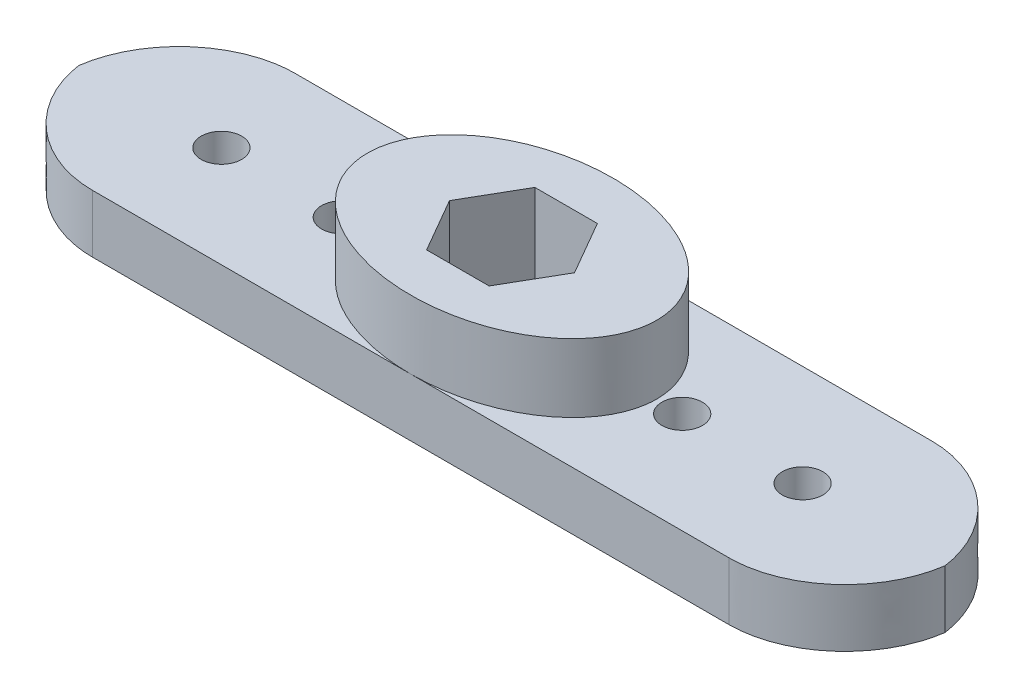
ISO-10303-21;
HEADER;
FILE_DESCRIPTION(('STEP AP214'),'2;1');
FILE_NAME('part.step','',(''),(''),'','','');
FILE_SCHEMA(('AUTOMOTIVE_DESIGN { 1 0 10303 214 1 1 1 1 }'));
ENDSEC;
DATA;
#1=APPLICATION_CONTEXT('core data for automotive mechanical design processes');
#2=APPLICATION_PROTOCOL_DEFINITION('international standard','automotive_design',2000,#1);
#3=PRODUCT_CONTEXT('',#1,'mechanical');
#4=PRODUCT('Part','Part','',(#3));
#5=PRODUCT_RELATED_PRODUCT_CATEGORY('part','',(#4));
#6=PRODUCT_DEFINITION_FORMATION('','',#4);
#7=PRODUCT_DEFINITION_CONTEXT('part definition',#1,'design');
#8=PRODUCT_DEFINITION('design','',#6,#7);
#9=PRODUCT_DEFINITION_SHAPE('','',#8);
#10=(LENGTH_UNIT() NAMED_UNIT(*) SI_UNIT(.MILLI.,.METRE.));
#11=(NAMED_UNIT(*) PLANE_ANGLE_UNIT() SI_UNIT($,.RADIAN.));
#12=(NAMED_UNIT(*) SI_UNIT($,.STERADIAN.) SOLID_ANGLE_UNIT());
#13=UNCERTAINTY_MEASURE_WITH_UNIT(LENGTH_MEASURE(1.E-05),#10,'distance_accuracy_value','');
#14=(GEOMETRIC_REPRESENTATION_CONTEXT(3) GLOBAL_UNCERTAINTY_ASSIGNED_CONTEXT((#13)) GLOBAL_UNIT_ASSIGNED_CONTEXT((#10,
#11,#12)) REPRESENTATION_CONTEXT('',''));
#15=CARTESIAN_POINT('',(0.,0.,0.));
#16=DIRECTION('',(0.,0.,1.));
#17=DIRECTION('',(1.,0.,0.));
#18=AXIS2_PLACEMENT_3D('',#15,#16,#17);
#19=CARTESIAN_POINT('',(0.,0.,0.));
#20=DIRECTION('',(0.,1.,0.));
#21=DIRECTION('',(0.,0.,1.));
#22=AXIS2_PLACEMENT_3D('',#19,#20,#21);
#23=PLANE('',#22);
#24=CARTESIAN_POINT('',(19.05,0.,-4.445));
#25=DIRECTION('',(0.,1.,0.));
#26=DIRECTION('',(0.,0.,1.));
#27=AXIS2_PLACEMENT_3D('',#24,#25,#26);
#28=CIRCLE('',#27,3.40894841798443);
#29=CARTESIAN_POINT('',(19.05,0.,-1.03605158201557));
#30=VERTEX_POINT('',#29);
#31=EDGE_CURVE('E764',#30,#30,#28,.T.);
#32=ORIENTED_EDGE('',*,*,#31,.T.);
#33=EDGE_LOOP('',(#32));
#34=FACE_BOUND('',#33,.T.);
#35=CARTESIAN_POINT('',(31.8008,0.,-4.44493866057612));
#36=DIRECTION('',(0.,1.,0.));
#37=DIRECTION('',(0.,0.,1.));
#38=AXIS2_PLACEMENT_3D('',#35,#36,#37);
#39=CIRCLE('',#38,0.889000000000003);
#40=CARTESIAN_POINT('',(31.8008,0.,-3.55593866057612));
#41=VERTEX_POINT('',#40);
#42=EDGE_CURVE('E504',#41,#41,#39,.F.);
#43=ORIENTED_EDGE('',*,*,#42,.F.);
#44=EDGE_LOOP('',(#43));
#45=FACE_BOUND('',#44,.T.);
#46=CARTESIAN_POINT('',(6.29920000000001,0.,-4.44493866057612));
#47=DIRECTION('',(0.,1.,0.));
#48=DIRECTION('',(0.,0.,1.));
#49=AXIS2_PLACEMENT_3D('',#46,#47,#48);
#50=CIRCLE('',#49,0.889);
#51=CARTESIAN_POINT('',(6.29920000000001,0.,-3.55593866057612));
#52=VERTEX_POINT('',#51);
#53=EDGE_CURVE('E505',#52,#52,#50,.T.);
#54=ORIENTED_EDGE('',*,*,#53,.T.);
#55=EDGE_LOOP('',(#54));
#56=FACE_BOUND('',#55,.T.);
#57=CARTESIAN_POINT('',(26.5176,0.,-4.44493866057612));
#58=DIRECTION('',(0.,1.,0.));
#59=DIRECTION('',(0.,0.,1.));
#60=AXIS2_PLACEMENT_3D('',#57,#58,#59);
#61=CIRCLE('',#60,0.889000000000003);
#62=CARTESIAN_POINT('',(26.5176,0.,-3.55593866057612));
#63=VERTEX_POINT('',#62);
#64=EDGE_CURVE('E499',#63,#63,#61,.F.);
#65=ORIENTED_EDGE('',*,*,#64,.F.);
#66=EDGE_LOOP('',(#65));
#67=FACE_BOUND('',#66,.T.);
#68=CARTESIAN_POINT('',(38.1,0.,-3.81));
#69=CARTESIAN_POINT('',(38.1,0.,-8.89));
#70=CARTESIAN_POINT('',(33.02,0.,-8.89));
#71=(BOUNDED_CURVE() B_SPLINE_CURVE(2,(#68,#69,#70),.UNSPECIFIED.,.F.,
.F.) B_SPLINE_CURVE_WITH_KNOTS((3,3),(0.,1.),
.UNSPECIFIED.) CURVE() GEOMETRIC_REPRESENTATION_ITEM() RATIONAL_B_SPLINE_CURVE((1.,
0.666666666666667,1.)) REPRESENTATION_ITEM(''));
#72=CARTESIAN_POINT('',(33.02,0.,-8.89));
#73=VERTEX_POINT('',#72);
#74=CARTESIAN_POINT('',(38.056287610097,0.,-4.44506336601882));
#75=VERTEX_POINT('',#74);
#76=EDGE_CURVE('E495',#73,#75,#71,.F.);
#77=ORIENTED_EDGE('',*,*,#76,.T.);
#78=CARTESIAN_POINT('',(33.02,0.,0.));
#79=CARTESIAN_POINT('',(38.1,0.,0.));
#80=CARTESIAN_POINT('',(38.1,0.,-5.08000000000002));
#81=(BOUNDED_CURVE() B_SPLINE_CURVE(2,(#78,#79,#80),.UNSPECIFIED.,.F.,
.F.) B_SPLINE_CURVE_WITH_KNOTS((3,3),(0.,1.),
.UNSPECIFIED.) CURVE() GEOMETRIC_REPRESENTATION_ITEM() RATIONAL_B_SPLINE_CURVE((1.,
0.666666666666667,1.)) REPRESENTATION_ITEM(''));
#82=CARTESIAN_POINT('',(33.02,0.,0.));
#83=VERTEX_POINT('',#82);
#84=EDGE_CURVE('E525',#75,#83,#81,.F.);
#85=ORIENTED_EDGE('',*,*,#84,.T.);
#86=DIRECTION('',(1.,0.,0.));
#87=VECTOR('',#86,1.);
#88=CARTESIAN_POINT('',(0.,0.,0.));
#89=LINE('',#88,#87);
#90=CARTESIAN_POINT('',(5.08,0.,0.));
#91=VERTEX_POINT('',#90);
#92=EDGE_CURVE('E548',#91,#83,#89,.T.);
#93=ORIENTED_EDGE('',*,*,#92,.F.);
#94=CARTESIAN_POINT('',(0.,0.,-5.08));
#95=CARTESIAN_POINT('',(0.,0.,0.));
#96=CARTESIAN_POINT('',(5.08,0.,0.));
#97=(BOUNDED_CURVE() B_SPLINE_CURVE(2,(#94,#95,#96),.UNSPECIFIED.,.F.,
.F.) B_SPLINE_CURVE_WITH_KNOTS((3,3),(0.,1.),
.UNSPECIFIED.) CURVE() GEOMETRIC_REPRESENTATION_ITEM() RATIONAL_B_SPLINE_CURVE((1.,
0.666666666666667,1.)) REPRESENTATION_ITEM(''));
#98=CARTESIAN_POINT('',(0.0437123899029518,0.,-4.44493663398118));
#99=VERTEX_POINT('',#98);
#100=EDGE_CURVE('E466',#91,#99,#97,.F.);
#101=ORIENTED_EDGE('',*,*,#100,.T.);
#102=CARTESIAN_POINT('',(5.08,0.,-8.89));
#103=CARTESIAN_POINT('',(0.,0.,-8.88999999999999));
#104=CARTESIAN_POINT('',(0.,0.,-3.81));
#105=(BOUNDED_CURVE() B_SPLINE_CURVE(2,(#102,#103,#104),.UNSPECIFIED.,.F.,
.F.) B_SPLINE_CURVE_WITH_KNOTS((3,3),(0.,1.),
.UNSPECIFIED.) CURVE() GEOMETRIC_REPRESENTATION_ITEM() RATIONAL_B_SPLINE_CURVE((1.,
0.666666666666667,1.)) REPRESENTATION_ITEM(''));
#106=CARTESIAN_POINT('',(5.08,0.,-8.89));
#107=VERTEX_POINT('',#106);
#108=EDGE_CURVE('E674',#99,#107,#105,.F.);
#109=ORIENTED_EDGE('',*,*,#108,.T.);
#110=DIRECTION('',(1.,0.,0.));
#111=VECTOR('',#110,1.);
#112=CARTESIAN_POINT('',(0.,0.,-8.89));
#113=LINE('',#112,#111);
#114=EDGE_CURVE('E682',#107,#73,#113,.T.);
#115=ORIENTED_EDGE('',*,*,#114,.T.);
#116=EDGE_LOOP('',(#77,#85,#93,#101,#109,#115));
#117=FACE_BOUND('',#116,.T.);
#118=CARTESIAN_POINT('',(11.5824,0.,-4.44493866057612));
#119=DIRECTION('',(0.,1.,0.));
#120=DIRECTION('',(0.,0.,1.));
#121=AXIS2_PLACEMENT_3D('',#118,#119,#120);
#122=CIRCLE('',#121,0.889);
#123=CARTESIAN_POINT('',(11.5824,0.,-3.55593866057612));
#124=VERTEX_POINT('',#123);
#125=EDGE_CURVE('E346',#124,#124,#122,.T.);
#126=ORIENTED_EDGE('',*,*,#125,.T.);
#127=EDGE_LOOP('',(#126));
#128=FACE_BOUND('',#127,.T.);
#129=ADVANCED_FACE('F217',(#34,#45,#56,#67,#117,#128),#23,.F.);
#130=CARTESIAN_POINT('',(0.,2.54,0.));
#131=DIRECTION('',(0.,1.,0.));
#132=DIRECTION('',(0.,0.,1.));
#133=AXIS2_PLACEMENT_3D('',#130,#131,#132);
#134=PLANE('',#133);
#135=CARTESIAN_POINT('',(11.5824,2.54,-4.44493866057612));
#136=DIRECTION('',(0.,1.,0.));
#137=DIRECTION('',(0.,0.,1.));
#138=AXIS2_PLACEMENT_3D('',#135,#136,#137);
#139=CIRCLE('',#138,0.889);
#140=CARTESIAN_POINT('',(11.5824,2.54,-3.55593866057612));
#141=VERTEX_POINT('',#140);
#142=EDGE_CURVE('E343',#141,#141,#139,.T.);
#143=ORIENTED_EDGE('',*,*,#142,.F.);
#144=EDGE_LOOP('',(#143));
#145=FACE_BOUND('',#144,.T.);
#146=CARTESIAN_POINT('',(6.29920000000001,2.54,-4.44493866057612));
#147=DIRECTION('',(0.,1.,0.));
#148=DIRECTION('',(0.,0.,1.));
#149=AXIS2_PLACEMENT_3D('',#146,#147,#148);
#150=CIRCLE('',#149,0.889);
#151=CARTESIAN_POINT('',(6.29920000000001,2.54,-3.55593866057612));
#152=VERTEX_POINT('',#151);
#153=EDGE_CURVE('E508',#152,#152,#150,.T.);
#154=ORIENTED_EDGE('',*,*,#153,.F.);
#155=EDGE_LOOP('',(#154));
#156=FACE_BOUND('',#155,.T.);
#157=DIRECTION('',(1.,0.,0.));
#158=VECTOR('',#157,1.);
#159=CARTESIAN_POINT('',(0.,2.54,0.));
#160=LINE('',#159,#158);
#161=CARTESIAN_POINT('',(5.08,2.54,0.));
#162=VERTEX_POINT('',#161);
#163=CARTESIAN_POINT('',(19.05,2.54,0.));
#164=VERTEX_POINT('',#163);
#165=EDGE_CURVE('E459',#162,#164,#160,.T.);
#166=ORIENTED_EDGE('',*,*,#165,.T.);
#167=CARTESIAN_POINT('',(19.05,2.54,-4.445));
#168=DIRECTION('',(0.,1.,0.));
#169=DIRECTION('',(1.,0.,0.));
#170=AXIS2_PLACEMENT_3D('',#167,#168,#169);
#171=ELLIPSE('',#170,6.35,4.445);
#172=CARTESIAN_POINT('',(19.05,2.54,-8.89));
#173=VERTEX_POINT('',#172);
#174=EDGE_CURVE('E482',#164,#173,#171,.F.);
#175=ORIENTED_EDGE('',*,*,#174,.T.);
#176=DIRECTION('',(1.,0.,0.));
#177=VECTOR('',#176,1.);
#178=CARTESIAN_POINT('',(0.,2.54,-8.89));
#179=LINE('',#178,#177);
#180=CARTESIAN_POINT('',(5.08,2.54,-8.89));
#181=VERTEX_POINT('',#180);
#182=EDGE_CURVE('E476',#181,#173,#179,.T.);
#183=ORIENTED_EDGE('',*,*,#182,.F.);
#184=CARTESIAN_POINT('',(0.,2.54,-3.81));
#185=CARTESIAN_POINT('',(0.,2.54,-8.88999999999999));
#186=CARTESIAN_POINT('',(5.08,2.54,-8.89));
#187=(BOUNDED_CURVE() B_SPLINE_CURVE(2,(#184,#185,#186),.UNSPECIFIED.,.F.,
.F.) B_SPLINE_CURVE_WITH_KNOTS((3,3),(0.,1.),
.UNSPECIFIED.) CURVE() GEOMETRIC_REPRESENTATION_ITEM() RATIONAL_B_SPLINE_CURVE((1.,
0.666666666666667,1.)) REPRESENTATION_ITEM(''));
#188=CARTESIAN_POINT('',(0.0437273957248955,2.54,-4.44493866057612));
#189=VERTEX_POINT('',#188);
#190=EDGE_CURVE('E566',#181,#189,#187,.F.);
#191=ORIENTED_EDGE('',*,*,#190,.T.);
#192=CARTESIAN_POINT('',(5.08,2.54,0.));
#193=CARTESIAN_POINT('',(0.,2.54,0.));
#194=CARTESIAN_POINT('',(0.,2.54,-5.08));
#195=(BOUNDED_CURVE() B_SPLINE_CURVE(2,(#192,#193,#194),.UNSPECIFIED.,.F.,
.F.) B_SPLINE_CURVE_WITH_KNOTS((3,3),(0.,1.),
.UNSPECIFIED.) CURVE() GEOMETRIC_REPRESENTATION_ITEM() RATIONAL_B_SPLINE_CURVE((1.,
0.666666666666667,1.)) REPRESENTATION_ITEM(''));
#196=EDGE_CURVE('E557',#189,#162,#195,.F.);
#197=ORIENTED_EDGE('',*,*,#196,.T.);
#198=EDGE_LOOP('',(#166,#175,#183,#191,#197));
#199=FACE_BOUND('',#198,.T.);
#200=ADVANCED_FACE('F392',(#145,#156,#199),#134,.T.);
#201=CARTESIAN_POINT('',(0.,2.54,-8.89));
#202=DIRECTION('',(0.,0.,-1.));
#203=DIRECTION('',(-1.,0.,0.));
#204=AXIS2_PLACEMENT_3D('',#201,#202,#203);
#205=PLANE('',#204);
#206=CARTESIAN_POINT('',(33.02,2.54,-8.89));
#207=VERTEX_POINT('',#206);
#208=EDGE_CURVE('E477',#173,#207,#179,.T.);
#209=ORIENTED_EDGE('',*,*,#208,.T.);
#210=CARTESIAN_POINT('',(33.02,-0.127,-8.89));
#211=CARTESIAN_POINT('',(33.02,0.804333333333334,-8.89));
#212=CARTESIAN_POINT('',(33.02,1.73566666666667,-8.89));
#213=CARTESIAN_POINT('',(33.02,2.667,-8.89));
#214=(BOUNDED_CURVE() B_SPLINE_CURVE(3,(#210,#211,#212,#213),.UNSPECIFIED.,.F.,
.F.) B_SPLINE_CURVE_WITH_KNOTS((4,4),(-0.002667,0.000127),
.UNSPECIFIED.) CURVE() GEOMETRIC_REPRESENTATION_ITEM() RATIONAL_B_SPLINE_CURVE((1.,1.,1.,1.)) REPRESENTATION_ITEM(''));
#215=EDGE_CURVE('E13',#207,#73,#214,.F.);
#216=ORIENTED_EDGE('',*,*,#215,.T.);
#217=ORIENTED_EDGE('',*,*,#114,.F.);
#218=CARTESIAN_POINT('',(5.08,2.667,-8.89));
#219=CARTESIAN_POINT('',(5.08,1.73566666666667,-8.89));
#220=CARTESIAN_POINT('',(5.08,0.804333333333335,-8.89));
#221=CARTESIAN_POINT('',(5.08,-0.127,-8.89));
#222=(BOUNDED_CURVE() B_SPLINE_CURVE(3,(#218,#219,#220,#221),.UNSPECIFIED.,.F.,
.F.) B_SPLINE_CURVE_WITH_KNOTS((4,4),(-0.000127,0.002667),
.UNSPECIFIED.) CURVE() GEOMETRIC_REPRESENTATION_ITEM() RATIONAL_B_SPLINE_CURVE((1.,1.,1.,1.)) REPRESENTATION_ITEM(''));
#223=EDGE_CURVE('E666',#107,#181,#222,.F.);
#224=ORIENTED_EDGE('',*,*,#223,.T.);
#225=ORIENTED_EDGE('',*,*,#182,.T.);
#226=EDGE_LOOP('',(#209,#216,#217,#224,#225));
#227=FACE_BOUND('',#226,.T.);
#228=ADVANCED_FACE('F436',(#227),#205,.T.);
#229=CARTESIAN_POINT('',(0.,2.54,0.));
#230=DIRECTION('',(0.,0.,-1.));
#231=DIRECTION('',(-1.,0.,0.));
#232=AXIS2_PLACEMENT_3D('',#229,#230,#231);
#233=PLANE('',#232);
#234=ORIENTED_EDGE('',*,*,#92,.T.);
#235=CARTESIAN_POINT('',(33.02,2.667,0.));
#236=CARTESIAN_POINT('',(33.02,1.73566666666667,0.));
#237=CARTESIAN_POINT('',(33.02,0.804333333333335,0.));
#238=CARTESIAN_POINT('',(33.02,-0.127,0.));
#239=(BOUNDED_CURVE() B_SPLINE_CURVE(3,(#235,#236,#237,#238),.UNSPECIFIED.,.F.,
.F.) B_SPLINE_CURVE_WITH_KNOTS((4,4),(-0.000127,0.002667),
.UNSPECIFIED.) CURVE() GEOMETRIC_REPRESENTATION_ITEM() RATIONAL_B_SPLINE_CURVE((1.,1.,1.,1.)) REPRESENTATION_ITEM(''));
#240=CARTESIAN_POINT('',(33.02,2.54,0.));
#241=VERTEX_POINT('',#240);
#242=EDGE_CURVE('E539',#83,#241,#239,.F.);
#243=ORIENTED_EDGE('',*,*,#242,.T.);
#244=EDGE_CURVE('E467',#164,#241,#160,.T.);
#245=ORIENTED_EDGE('',*,*,#244,.F.);
#246=ORIENTED_EDGE('',*,*,#165,.F.);
#247=CARTESIAN_POINT('',(5.08,-0.127,0.));
#248=CARTESIAN_POINT('',(5.08,0.804333333333334,0.));
#249=CARTESIAN_POINT('',(5.08,1.73566666666667,0.));
#250=CARTESIAN_POINT('',(5.08,2.667,0.));
#251=(BOUNDED_CURVE() B_SPLINE_CURVE(3,(#247,#248,#249,#250),.UNSPECIFIED.,.F.,
.F.) B_SPLINE_CURVE_WITH_KNOTS((4,4),(-0.002667,0.000127),
.UNSPECIFIED.) CURVE() GEOMETRIC_REPRESENTATION_ITEM() RATIONAL_B_SPLINE_CURVE((1.,1.,1.,1.)) REPRESENTATION_ITEM(''));
#252=EDGE_CURVE('E483',#162,#91,#251,.F.);
#253=ORIENTED_EDGE('',*,*,#252,.T.);
#254=EDGE_LOOP('',(#234,#243,#245,#246,#253));
#255=FACE_BOUND('',#254,.T.);
#256=ADVANCED_FACE('F390',(#255),#233,.F.);
#257=CARTESIAN_POINT('',(31.8008,2.54,-4.44493866057612));
#258=DIRECTION('',(0.,1.,0.));
#259=DIRECTION('',(0.,0.,1.));
#260=AXIS2_PLACEMENT_3D('',#257,#258,#259);
#261=CIRCLE('',#260,0.889000000000003);
#262=CARTESIAN_POINT('',(31.8008,2.54,-3.55593866057612));
#263=VERTEX_POINT('',#262);
#264=EDGE_CURVE('E501',#263,#263,#261,.F.);
#265=ORIENTED_EDGE('',*,*,#264,.T.);
#266=EDGE_LOOP('',(#265));
#267=FACE_BOUND('',#266,.T.);
#268=CARTESIAN_POINT('',(26.5176,2.54,-4.44493866057612));
#269=DIRECTION('',(0.,1.,0.));
#270=DIRECTION('',(0.,0.,1.));
#271=AXIS2_PLACEMENT_3D('',#268,#269,#270);
#272=CIRCLE('',#271,0.889000000000003);
#273=CARTESIAN_POINT('',(26.5176,2.54,-3.55593866057612));
#274=VERTEX_POINT('',#273);
#275=EDGE_CURVE('E496',#274,#274,#272,.F.);
#276=ORIENTED_EDGE('',*,*,#275,.T.);
#277=EDGE_LOOP('',(#276));
#278=FACE_BOUND('',#277,.T.);
#279=ORIENTED_EDGE('',*,*,#244,.T.);
#280=CARTESIAN_POINT('',(38.1,2.54,-5.08000000000002));
#281=CARTESIAN_POINT('',(38.1,2.54,0.));
#282=CARTESIAN_POINT('',(33.02,2.54,0.));
#283=(BOUNDED_CURVE() B_SPLINE_CURVE(2,(#280,#281,#282),.UNSPECIFIED.,.F.,
.F.) B_SPLINE_CURVE_WITH_KNOTS((3,3),(0.,1.),
.UNSPECIFIED.) CURVE() GEOMETRIC_REPRESENTATION_ITEM() RATIONAL_B_SPLINE_CURVE((1.,
0.666666666666667,1.)) REPRESENTATION_ITEM(''));
#284=CARTESIAN_POINT('',(38.0562726042747,2.54,-4.44506133942384));
#285=VERTEX_POINT('',#284);
#286=EDGE_CURVE('E231',#241,#285,#283,.F.);
#287=ORIENTED_EDGE('',*,*,#286,.T.);
#288=CARTESIAN_POINT('',(33.02,2.54,-8.89));
#289=CARTESIAN_POINT('',(38.1,2.54,-8.89));
#290=CARTESIAN_POINT('',(38.1,2.54,-3.81));
#291=(BOUNDED_CURVE() B_SPLINE_CURVE(2,(#288,#289,#290),.UNSPECIFIED.,.F.,
.F.) B_SPLINE_CURVE_WITH_KNOTS((3,3),(0.,1.),
.UNSPECIFIED.) CURVE() GEOMETRIC_REPRESENTATION_ITEM() RATIONAL_B_SPLINE_CURVE((1.,
0.666666666666667,1.)) REPRESENTATION_ITEM(''));
#292=EDGE_CURVE('E242',#285,#207,#291,.F.);
#293=ORIENTED_EDGE('',*,*,#292,.T.);
#294=ORIENTED_EDGE('',*,*,#208,.F.);
#295=EDGE_CURVE('E479',#173,#164,#171,.F.);
#296=ORIENTED_EDGE('',*,*,#295,.T.);
#297=EDGE_LOOP('',(#279,#287,#293,#294,#296));
#298=FACE_BOUND('',#297,.T.);
#299=ADVANCED_FACE('F385',(#267,#278,#298),#134,.T.);
#300=CARTESIAN_POINT('',(0.,-0.127,-5.08));
#301=CARTESIAN_POINT('',(0.,0.804333333333334,-5.08));
#302=CARTESIAN_POINT('',(0.,1.73566666666667,-5.08));
#303=CARTESIAN_POINT('',(0.,2.667,-5.08));
#304=CARTESIAN_POINT('',(0.,-0.127,0.));
#305=CARTESIAN_POINT('',(0.,0.804333333333334,0.));
#306=CARTESIAN_POINT('',(0.,1.73566666666667,0.));
#307=CARTESIAN_POINT('',(0.,2.667,0.));
#308=CARTESIAN_POINT('',(5.08,-0.127,0.));
#309=CARTESIAN_POINT('',(5.08,0.804333333333334,0.));
#310=CARTESIAN_POINT('',(5.08,1.73566666666667,0.));
#311=CARTESIAN_POINT('',(5.08,2.667,0.));
#312=(BOUNDED_SURFACE() B_SPLINE_SURFACE(2,3,((#300,#301,#302,#303),(#304,#305,#306,#307),(#308,
#309,#310,#311)),.UNSPECIFIED.,.F.,.F.,.F.) B_SPLINE_SURFACE_WITH_KNOTS((3,3),(4,4),(0.,1.),
(-0.002667,0.000127),
.UNSPECIFIED.) GEOMETRIC_REPRESENTATION_ITEM() RATIONAL_B_SPLINE_SURFACE(((1.,1.,1.,1.),
(0.666666666666667,0.666666666666667,0.666666666666667,0.666666666666667),(1.,1.,1.,1.))) REPRESENTATION_ITEM('') SURFACE());
#313=CARTESIAN_POINT('',(0.0441742859827842,-0.127,-4.445));
#314=CARTESIAN_POINT('',(0.0441742859827842,0.804333333333335,-4.445));
#315=CARTESIAN_POINT('',(0.0441742859827842,1.73566666666667,-4.445));
#316=CARTESIAN_POINT('',(0.0441742859827842,2.667,-4.445));
#317=(BOUNDED_CURVE() B_SPLINE_CURVE(3,(#313,#314,#315,#316),.UNSPECIFIED.,.F.,
.F.) B_SPLINE_CURVE_WITH_KNOTS((4,4),(-0.000127,0.002667),
.UNSPECIFIED.) CURVE() GEOMETRIC_REPRESENTATION_ITEM() RATIONAL_B_SPLINE_CURVE((0.945043689691027,
0.945043689691027,0.945043689691027,0.945043689691027)) REPRESENTATION_ITEM(''));
#318=EDGE_CURVE('E373',#99,#189,#317,.T.);
#319=ORIENTED_EDGE('',*,*,#252,.F.);
#320=ORIENTED_EDGE('',*,*,#196,.F.);
#321=ORIENTED_EDGE('',*,*,#318,.F.);
#322=ORIENTED_EDGE('',*,*,#100,.F.);
#323=EDGE_LOOP('',(#319,#320,#321,#322));
#324=FACE_BOUND('',#323,.T.);
#325=ADVANCED_FACE('F389',(#324),#312,.T.);
#326=CARTESIAN_POINT('',(0.,2.667,-3.81));
#327=CARTESIAN_POINT('',(0.,1.73566666666667,-3.81));
#328=CARTESIAN_POINT('',(0.,0.804333333333335,-3.81));
#329=CARTESIAN_POINT('',(0.,-0.127,-3.81));
#330=CARTESIAN_POINT('',(0.,2.667,-8.88999999999999));
#331=CARTESIAN_POINT('',(0.,1.73566666666667,-8.88999999999999));
#332=CARTESIAN_POINT('',(0.,0.804333333333333,-8.88999999999999));
#333=CARTESIAN_POINT('',(0.,-0.127,-8.88999999999999));
#334=CARTESIAN_POINT('',(5.08,2.667,-8.89));
#335=CARTESIAN_POINT('',(5.08,1.73566666666667,-8.89));
#336=CARTESIAN_POINT('',(5.08,0.804333333333335,-8.89));
#337=CARTESIAN_POINT('',(5.08,-0.127,-8.89));
#338=(BOUNDED_SURFACE() B_SPLINE_SURFACE(2,3,((#326,#327,#328,#329),(#330,#331,#332,#333),(#334,
#335,#336,#337)),.UNSPECIFIED.,.F.,.F.,.F.) B_SPLINE_SURFACE_WITH_KNOTS((3,3),(4,4),(0.,1.),
(-0.000127,0.002667),
.UNSPECIFIED.) GEOMETRIC_REPRESENTATION_ITEM() RATIONAL_B_SPLINE_SURFACE(((1.,1.,1.,1.),
(0.666666666666667,0.666666666666667,0.666666666666667,0.666666666666667),(1.,1.,1.,1.))) REPRESENTATION_ITEM('') SURFACE());
#339=ORIENTED_EDGE('',*,*,#190,.F.);
#340=ORIENTED_EDGE('',*,*,#223,.F.);
#341=ORIENTED_EDGE('',*,*,#108,.F.);
#342=ORIENTED_EDGE('',*,*,#318,.T.);
#343=EDGE_LOOP('',(#339,#340,#341,#342));
#344=FACE_BOUND('',#343,.T.);
#345=ADVANCED_FACE('F382',(#344),#338,.T.);
#346=CARTESIAN_POINT('',(19.05,5.5372,-4.445));
#347=DIRECTION('',(0.,1.,0.));
#348=DIRECTION('',(1.,0.,0.));
#349=AXIS2_PLACEMENT_3D('',#346,#347,#348);
#350=ELLIPSE('',#349,6.35,4.445);
#351=DIRECTION('',(0.,-1.,0.));
#352=VECTOR('',#351,1.);
#353=SURFACE_OF_LINEAR_EXTRUSION('',#350,#352);
#354=ORIENTED_EDGE('',*,*,#174,.F.);
#355=ORIENTED_EDGE('',*,*,#295,.F.);
#356=EDGE_LOOP('',(#354,#355));
#357=FACE_BOUND('',#356,.T.);
#358=CARTESIAN_POINT('',(25.4,5.5372,-4.44500000000001));
#359=VERTEX_POINT('',#358);
#360=EDGE_CURVE('E359',#359,#359,#350,.T.);
#361=ORIENTED_EDGE('',*,*,#360,.F.);
#362=EDGE_LOOP('',(#361));
#363=FACE_BOUND('',#362,.T.);
#364=ADVANCED_FACE('F377',(#357,#363),#353,.F.);
#365=CARTESIAN_POINT('',(19.05,5.5372,-4.445));
#366=DIRECTION('',(0.,1.,0.));
#367=DIRECTION('',(0.,0.,1.));
#368=AXIS2_PLACEMENT_3D('',#365,#366,#367);
#369=PLANE('',#368);
#370=DIRECTION('',(0.500000000000001,0.,0.866025403784438));
#371=VECTOR('',#370,1.);
#372=CARTESIAN_POINT('',(16.9932762685523,5.5372,-3.25755));
#373=LINE('',#372,#371);
#374=CARTESIAN_POINT('',(16.3077016914031,5.5372,-4.44500000000001));
#375=VERTEX_POINT('',#374);
#376=CARTESIAN_POINT('',(17.6788508457016,5.5372,-2.0701));
#377=VERTEX_POINT('',#376);
#378=EDGE_CURVE('E325',#375,#377,#373,.T.);
#379=ORIENTED_EDGE('',*,*,#378,.F.);
#380=DIRECTION('',(-0.5,0.,0.866025403784439));
#381=VECTOR('',#380,1.);
#382=CARTESIAN_POINT('',(16.9932762685523,5.5372,-5.63245000000001));
#383=LINE('',#382,#381);
#384=CARTESIAN_POINT('',(17.6788508457016,5.5372,-6.81990000000001));
#385=VERTEX_POINT('',#384);
#386=EDGE_CURVE('E492',#385,#375,#383,.T.);
#387=ORIENTED_EDGE('',*,*,#386,.F.);
#388=DIRECTION('',(-1.,0.,0.));
#389=VECTOR('',#388,1.);
#390=CARTESIAN_POINT('',(19.05,5.5372,-6.81990000000001));
#391=LINE('',#390,#389);
#392=CARTESIAN_POINT('',(20.4211491542984,5.5372,-6.81990000000001));
#393=VERTEX_POINT('',#392);
#394=EDGE_CURVE('E490',#393,#385,#391,.T.);
#395=ORIENTED_EDGE('',*,*,#394,.F.);
#396=DIRECTION('',(-0.5,0.,-0.866025403784439));
#397=VECTOR('',#396,1.);
#398=CARTESIAN_POINT('',(21.1067237314477,5.5372,-5.63245000000001));
#399=LINE('',#398,#397);
#400=CARTESIAN_POINT('',(21.7922983085969,5.5372,-4.445));
#401=VERTEX_POINT('',#400);
#402=EDGE_CURVE('E488',#401,#393,#399,.T.);
#403=ORIENTED_EDGE('',*,*,#402,.F.);
#404=DIRECTION('',(0.5,0.,-0.866025403784439));
#405=VECTOR('',#404,1.);
#406=CARTESIAN_POINT('',(21.1067237314477,5.5372,-3.25755));
#407=LINE('',#406,#405);
#408=CARTESIAN_POINT('',(20.4211491542984,5.5372,-2.0701));
#409=VERTEX_POINT('',#408);
#410=EDGE_CURVE('E486',#409,#401,#407,.T.);
#411=ORIENTED_EDGE('',*,*,#410,.F.);
#412=DIRECTION('',(1.,0.,0.));
#413=VECTOR('',#412,1.);
#414=CARTESIAN_POINT('',(19.05,5.5372,-2.0701));
#415=LINE('',#414,#413);
#416=EDGE_CURVE('E484',#377,#409,#415,.T.);
#417=ORIENTED_EDGE('',*,*,#416,.F.);
#418=EDGE_LOOP('',(#379,#387,#395,#403,#411,#417));
#419=FACE_BOUND('',#418,.T.);
#420=ORIENTED_EDGE('',*,*,#360,.T.);
#421=EDGE_LOOP('',(#420));
#422=FACE_BOUND('',#421,.T.);
#423=ADVANCED_FACE('F381',(#419,#422),#369,.T.);
#424=CARTESIAN_POINT('',(14.1555177284632,5.5372,-8.17269197104678));
#425=DIRECTION('',(-0.866025403784438,0.,0.5));
#426=DIRECTION('',(0.500000000000001,0.,0.866025403784438));
#427=AXIS2_PLACEMENT_3D('',#424,#425,#426);
#428=PLANE('',#427);
#429=ORIENTED_EDGE('',*,*,#378,.T.);
#430=DIRECTION('',(0.,1.,0.));
#431=VECTOR('',#430,1.);
#432=CARTESIAN_POINT('',(17.6788508457016,5.5372,-2.0701));
#433=LINE('',#432,#431);
#434=CARTESIAN_POINT('',(17.6788508457016,1.524,-2.0701));
#435=VERTEX_POINT('',#434);
#436=EDGE_CURVE('E317',#435,#377,#433,.T.);
#437=ORIENTED_EDGE('',*,*,#436,.F.);
#438=DIRECTION('',(0.5,0.,0.866025403784438));
#439=VECTOR('',#438,1.);
#440=CARTESIAN_POINT('',(14.1555177284632,1.524,-8.17269197104678));
#441=LINE('',#440,#439);
#442=CARTESIAN_POINT('',(16.3077016914031,1.524,-4.44500000000001));
#443=VERTEX_POINT('',#442);
#444=EDGE_CURVE('E322',#443,#435,#441,.T.);
#445=ORIENTED_EDGE('',*,*,#444,.F.);
#446=DIRECTION('',(0.,1.,0.));
#447=VECTOR('',#446,1.);
#448=CARTESIAN_POINT('',(16.3077016914031,5.5372,-4.44500000000001));
#449=LINE('',#448,#447);
#450=EDGE_CURVE('E357',#443,#375,#449,.T.);
#451=ORIENTED_EDGE('',*,*,#450,.T.);
#452=EDGE_LOOP('',(#429,#437,#445,#451));
#453=FACE_BOUND('',#452,.T.);
#454=ADVANCED_FACE('F319',(#453),#428,.F.);
#455=CARTESIAN_POINT('',(10.3060348086414,5.5372,5.95019197104677));
#456=DIRECTION('',(-0.866025403784439,0.,-0.5));
#457=DIRECTION('',(-0.5,0.,0.866025403784439));
#458=AXIS2_PLACEMENT_3D('',#455,#456,#457);
#459=PLANE('',#458);
#460=ORIENTED_EDGE('',*,*,#386,.T.);
#461=ORIENTED_EDGE('',*,*,#450,.F.);
#462=DIRECTION('',(-0.5,0.,0.866025403784439));
#463=VECTOR('',#462,1.);
#464=CARTESIAN_POINT('',(10.3060348086414,1.524,5.95019197104677));
#465=LINE('',#464,#463);
#466=CARTESIAN_POINT('',(17.6788508457016,1.524,-6.81990000000001));
#467=VERTEX_POINT('',#466);
#468=EDGE_CURVE('E329',#467,#443,#465,.T.);
#469=ORIENTED_EDGE('',*,*,#468,.F.);
#470=DIRECTION('',(0.,1.,0.));
#471=VECTOR('',#470,1.);
#472=CARTESIAN_POINT('',(17.6788508457016,5.5372,-6.81990000000001));
#473=LINE('',#472,#471);
#474=EDGE_CURVE('E360',#467,#385,#473,.T.);
#475=ORIENTED_EDGE('',*,*,#474,.T.);
#476=EDGE_LOOP('',(#460,#461,#469,#475));
#477=FACE_BOUND('',#476,.T.);
#478=ADVANCED_FACE('F810',(#477),#459,.F.);
#479=CARTESIAN_POINT('',(0.,5.5372,-6.81990000000001));
#480=DIRECTION('',(0.,0.,-1.));
#481=DIRECTION('',(-1.,0.,0.));
#482=AXIS2_PLACEMENT_3D('',#479,#480,#481);
#483=PLANE('',#482);
#484=ORIENTED_EDGE('',*,*,#394,.T.);
#485=ORIENTED_EDGE('',*,*,#474,.F.);
#486=DIRECTION('',(-1.,0.,0.));
#487=VECTOR('',#486,1.);
#488=CARTESIAN_POINT('',(0.,1.524,-6.81990000000001));
#489=LINE('',#488,#487);
#490=CARTESIAN_POINT('',(20.4211491542984,1.524,-6.81990000000001));
#491=VERTEX_POINT('',#490);
#492=EDGE_CURVE('E354',#491,#467,#489,.T.);
#493=ORIENTED_EDGE('',*,*,#492,.F.);
#494=DIRECTION('',(0.,1.,0.));
#495=VECTOR('',#494,1.);
#496=CARTESIAN_POINT('',(20.4211491542984,5.5372,-6.81990000000001));
#497=LINE('',#496,#495);
#498=EDGE_CURVE('E363',#491,#393,#497,.T.);
#499=ORIENTED_EDGE('',*,*,#498,.T.);
#500=EDGE_LOOP('',(#484,#485,#493,#499));
#501=FACE_BOUND('',#500,.T.);
#502=ADVANCED_FACE('F813',(#501),#483,.F.);
#503=CARTESIAN_POINT('',(18.2689651913586,5.5372,-10.5475919710468));
#504=DIRECTION('',(0.866025403784439,0.,-0.5));
#505=DIRECTION('',(-0.5,0.,-0.866025403784439));
#506=AXIS2_PLACEMENT_3D('',#503,#504,#505);
#507=PLANE('',#506);
#508=ORIENTED_EDGE('',*,*,#402,.T.);
#509=ORIENTED_EDGE('',*,*,#498,.F.);
#510=DIRECTION('',(-0.5,0.,-0.866025403784439));
#511=VECTOR('',#510,1.);
#512=CARTESIAN_POINT('',(18.2689651913586,1.524,-10.5475919710468));
#513=LINE('',#512,#511);
#514=CARTESIAN_POINT('',(21.7922983085969,1.524,-4.445));
#515=VERTEX_POINT('',#514);
#516=EDGE_CURVE('E351',#515,#491,#513,.T.);
#517=ORIENTED_EDGE('',*,*,#516,.F.);
#518=DIRECTION('',(0.,1.,0.));
#519=VECTOR('',#518,1.);
#520=CARTESIAN_POINT('',(21.7922983085969,5.5372,-4.445));
#521=LINE('',#520,#519);
#522=EDGE_CURVE('E366',#515,#401,#521,.T.);
#523=ORIENTED_EDGE('',*,*,#522,.T.);
#524=EDGE_LOOP('',(#508,#509,#517,#523));
#525=FACE_BOUND('',#524,.T.);
#526=ADVANCED_FACE('F817',(#525),#507,.F.);
#527=CARTESIAN_POINT('',(14.4194822715368,5.5372,8.32509197104678));
#528=DIRECTION('',(0.866025403784439,0.,0.5));
#529=DIRECTION('',(0.5,0.,-0.866025403784439));
#530=AXIS2_PLACEMENT_3D('',#527,#528,#529);
#531=PLANE('',#530);
#532=ORIENTED_EDGE('',*,*,#410,.T.);
#533=ORIENTED_EDGE('',*,*,#522,.F.);
#534=DIRECTION('',(0.5,0.,-0.866025403784439));
#535=VECTOR('',#534,1.);
#536=CARTESIAN_POINT('',(14.4194822715368,1.524,8.32509197104678));
#537=LINE('',#536,#535);
#538=CARTESIAN_POINT('',(20.4211491542984,1.524,-2.0701));
#539=VERTEX_POINT('',#538);
#540=EDGE_CURVE('E338',#539,#515,#537,.T.);
#541=ORIENTED_EDGE('',*,*,#540,.F.);
#542=DIRECTION('',(0.,1.,0.));
#543=VECTOR('',#542,1.);
#544=CARTESIAN_POINT('',(20.4211491542984,5.5372,-2.0701));
#545=LINE('',#544,#543);
#546=EDGE_CURVE('E328',#539,#409,#545,.T.);
#547=ORIENTED_EDGE('',*,*,#546,.T.);
#548=EDGE_LOOP('',(#532,#533,#541,#547));
#549=FACE_BOUND('',#548,.T.);
#550=ADVANCED_FACE('F821',(#549),#531,.F.);
#551=CARTESIAN_POINT('',(0.,5.5372,-2.0701));
#552=DIRECTION('',(0.,0.,1.));
#553=DIRECTION('',(1.,0.,0.));
#554=AXIS2_PLACEMENT_3D('',#551,#552,#553);
#555=PLANE('',#554);
#556=ORIENTED_EDGE('',*,*,#416,.T.);
#557=ORIENTED_EDGE('',*,*,#546,.F.);
#558=DIRECTION('',(1.,0.,0.));
#559=VECTOR('',#558,1.);
#560=CARTESIAN_POINT('',(0.,1.524,-2.0701));
#561=LINE('',#560,#559);
#562=EDGE_CURVE('E332',#435,#539,#561,.T.);
#563=ORIENTED_EDGE('',*,*,#562,.F.);
#564=ORIENTED_EDGE('',*,*,#436,.T.);
#565=EDGE_LOOP('',(#556,#557,#563,#564));
#566=FACE_BOUND('',#565,.T.);
#567=ADVANCED_FACE('F333',(#566),#555,.F.);
#568=CARTESIAN_POINT('',(0.,1.524,0.));
#569=DIRECTION('',(0.,1.,0.));
#570=DIRECTION('',(0.,0.,1.));
#571=AXIS2_PLACEMENT_3D('',#568,#569,#570);
#572=PLANE('',#571);
#573=ORIENTED_EDGE('',*,*,#444,.T.);
#574=ORIENTED_EDGE('',*,*,#562,.T.);
#575=ORIENTED_EDGE('',*,*,#540,.T.);
#576=ORIENTED_EDGE('',*,*,#516,.T.);
#577=ORIENTED_EDGE('',*,*,#492,.T.);
#578=ORIENTED_EDGE('',*,*,#468,.T.);
#579=EDGE_LOOP('',(#573,#574,#575,#576,#577,#578));
#580=FACE_BOUND('',#579,.T.);
#581=ADVANCED_FACE('F340',(#580),#572,.T.);
#582=CARTESIAN_POINT('',(26.5176,-0.762,-4.44493866057612));
#583=DIRECTION('',(0.,1.,0.));
#584=DIRECTION('',(0.,0.,1.));
#585=AXIS2_PLACEMENT_3D('',#582,#583,#584);
#586=CYLINDRICAL_SURFACE('',#585,0.889000000000003);
#587=ORIENTED_EDGE('',*,*,#275,.F.);
#588=EDGE_LOOP('',(#587));
#589=FACE_BOUND('',#588,.T.);
#590=ORIENTED_EDGE('',*,*,#64,.T.);
#591=EDGE_LOOP('',(#590));
#592=FACE_BOUND('',#591,.T.);
#593=ADVANCED_FACE('F803',(#589,#592),#586,.F.);
#594=CARTESIAN_POINT('',(31.8008,-0.762,-4.44493866057612));
#595=DIRECTION('',(0.,1.,0.));
#596=DIRECTION('',(0.,0.,1.));
#597=AXIS2_PLACEMENT_3D('',#594,#595,#596);
#598=CYLINDRICAL_SURFACE('',#597,0.889000000000003);
#599=ORIENTED_EDGE('',*,*,#264,.F.);
#600=EDGE_LOOP('',(#599));
#601=FACE_BOUND('',#600,.T.);
#602=ORIENTED_EDGE('',*,*,#42,.T.);
#603=EDGE_LOOP('',(#602));
#604=FACE_BOUND('',#603,.T.);
#605=ADVANCED_FACE('F797',(#601,#604),#598,.F.);
#606=CARTESIAN_POINT('',(6.29920000000001,-0.762,-4.44493866057612));
#607=DIRECTION('',(0.,1.,0.));
#608=DIRECTION('',(0.,0.,1.));
#609=AXIS2_PLACEMENT_3D('',#606,#607,#608);
#610=CYLINDRICAL_SURFACE('',#609,0.889);
#611=ORIENTED_EDGE('',*,*,#153,.T.);
#612=EDGE_LOOP('',(#611));
#613=FACE_BOUND('',#612,.T.);
#614=ORIENTED_EDGE('',*,*,#53,.F.);
#615=EDGE_LOOP('',(#614));
#616=FACE_BOUND('',#615,.T.);
#617=ADVANCED_FACE('F777',(#613,#616),#610,.F.);
#618=CARTESIAN_POINT('',(11.5824,-0.762,-4.44493866057612));
#619=DIRECTION('',(0.,1.,0.));
#620=DIRECTION('',(0.,0.,1.));
#621=AXIS2_PLACEMENT_3D('',#618,#619,#620);
#622=CYLINDRICAL_SURFACE('',#621,0.889);
#623=ORIENTED_EDGE('',*,*,#142,.T.);
#624=EDGE_LOOP('',(#623));
#625=FACE_BOUND('',#624,.T.);
#626=ORIENTED_EDGE('',*,*,#125,.F.);
#627=EDGE_LOOP('',(#626));
#628=FACE_BOUND('',#627,.T.);
#629=ADVANCED_FACE('F788',(#625,#628),#622,.F.);
#630=CARTESIAN_POINT('',(38.1,-0.127,-3.81));
#631=CARTESIAN_POINT('',(38.1,0.804333333333334,-3.81));
#632=CARTESIAN_POINT('',(38.1,1.73566666666667,-3.81));
#633=CARTESIAN_POINT('',(38.1,2.667,-3.81));
#634=CARTESIAN_POINT('',(38.1,-0.127,-8.89));
#635=CARTESIAN_POINT('',(38.1,0.804333333333334,-8.89));
#636=CARTESIAN_POINT('',(38.1,1.73566666666667,-8.89));
#637=CARTESIAN_POINT('',(38.1,2.667,-8.89));
#638=CARTESIAN_POINT('',(33.02,-0.127,-8.89));
#639=CARTESIAN_POINT('',(33.02,0.804333333333334,-8.89));
#640=CARTESIAN_POINT('',(33.02,1.73566666666667,-8.89));
#641=CARTESIAN_POINT('',(33.02,2.667,-8.89));
#642=(BOUNDED_SURFACE() B_SPLINE_SURFACE(2,3,((#630,#631,#632,#633),(#634,#635,#636,#637),(#638,
#639,#640,#641)),.UNSPECIFIED.,.F.,.F.,.F.) B_SPLINE_SURFACE_WITH_KNOTS((3,3),(4,4),(0.,1.),
(-0.002667,0.000127),
.UNSPECIFIED.) GEOMETRIC_REPRESENTATION_ITEM() RATIONAL_B_SPLINE_SURFACE(((1.,1.,1.,1.),
(0.666666666666667,0.666666666666667,0.666666666666667,0.666666666666667),(1.,1.,1.,1.))) REPRESENTATION_ITEM('') SURFACE());
#643=CARTESIAN_POINT('',(38.0558257140172,-0.127,-4.44500000000002));
#644=CARTESIAN_POINT('',(38.0558257140172,0.804333333333335,-4.44500000000002));
#645=CARTESIAN_POINT('',(38.0558257140172,1.73566666666667,-4.44500000000002));
#646=CARTESIAN_POINT('',(38.0558257140172,2.667,-4.44500000000002));
#647=(BOUNDED_CURVE() B_SPLINE_CURVE(3,(#643,#644,#645,#646),.UNSPECIFIED.,.F.,
.F.) B_SPLINE_CURVE_WITH_KNOTS((4,4),(-0.000127,0.002667),
.UNSPECIFIED.) CURVE() GEOMETRIC_REPRESENTATION_ITEM() RATIONAL_B_SPLINE_CURVE((0.945043689691027,
0.945043689691027,0.945043689691027,0.945043689691027)) REPRESENTATION_ITEM(''));
#648=EDGE_CURVE('E500',#75,#285,#647,.T.);
#649=ORIENTED_EDGE('',*,*,#215,.F.);
#650=ORIENTED_EDGE('',*,*,#292,.F.);
#651=ORIENTED_EDGE('',*,*,#648,.F.);
#652=ORIENTED_EDGE('',*,*,#76,.F.);
#653=EDGE_LOOP('',(#649,#650,#651,#652));
#654=FACE_BOUND('',#653,.T.);
#655=ADVANCED_FACE('F220',(#654),#642,.T.);
#656=CARTESIAN_POINT('',(38.1,2.667,-5.08000000000002));
#657=CARTESIAN_POINT('',(38.1,1.73566666666667,-5.08000000000002));
#658=CARTESIAN_POINT('',(38.1,0.804333333333335,-5.08000000000002));
#659=CARTESIAN_POINT('',(38.1,-0.127,-5.08000000000002));
#660=CARTESIAN_POINT('',(38.1,2.667,0.));
#661=CARTESIAN_POINT('',(38.1,1.73566666666667,0.));
#662=CARTESIAN_POINT('',(38.1,0.804333333333333,0.));
#663=CARTESIAN_POINT('',(38.1,-0.127,0.));
#664=CARTESIAN_POINT('',(33.02,2.667,0.));
#665=CARTESIAN_POINT('',(33.02,1.73566666666667,0.));
#666=CARTESIAN_POINT('',(33.02,0.804333333333335,0.));
#667=CARTESIAN_POINT('',(33.02,-0.127,0.));
#668=(BOUNDED_SURFACE() B_SPLINE_SURFACE(2,3,((#656,#657,#658,#659),(#660,#661,#662,#663),(#664,
#665,#666,#667)),.UNSPECIFIED.,.F.,.F.,.F.) B_SPLINE_SURFACE_WITH_KNOTS((3,3),(4,4),(0.,1.),
(-0.000127,0.002667),
.UNSPECIFIED.) GEOMETRIC_REPRESENTATION_ITEM() RATIONAL_B_SPLINE_SURFACE(((1.,1.,1.,1.),
(0.666666666666667,0.666666666666667,0.666666666666667,0.666666666666667),(1.,1.,1.,1.))) REPRESENTATION_ITEM('') SURFACE());
#669=ORIENTED_EDGE('',*,*,#286,.F.);
#670=ORIENTED_EDGE('',*,*,#242,.F.);
#671=ORIENTED_EDGE('',*,*,#84,.F.);
#672=ORIENTED_EDGE('',*,*,#648,.T.);
#673=EDGE_LOOP('',(#669,#670,#671,#672));
#674=FACE_BOUND('',#673,.T.);
#675=ADVANCED_FACE('F586',(#674),#668,.T.);
#676=CARTESIAN_POINT('',(19.05,1.27,-4.445));
#677=DIRECTION('',(0.,-1.,0.));
#678=DIRECTION('',(0.,0.,-1.));
#679=AXIS2_PLACEMENT_3D('',#676,#677,#678);
#680=CYLINDRICAL_SURFACE('',#679,3.40894841798443);
#681=CARTESIAN_POINT('',(19.05,1.27,-4.445));
#682=DIRECTION('',(0.,1.,0.));
#683=DIRECTION('',(0.,0.,1.));
#684=AXIS2_PLACEMENT_3D('',#681,#682,#683);
#685=CIRCLE('',#684,3.40894841798443);
#686=CARTESIAN_POINT('',(19.05,1.27,-1.03605158201557));
#687=VERTEX_POINT('',#686);
#688=EDGE_CURVE('E762',#687,#687,#685,.T.);
#689=ORIENTED_EDGE('',*,*,#688,.T.);
#690=EDGE_LOOP('',(#689));
#691=FACE_BOUND('',#690,.T.);
#692=ORIENTED_EDGE('',*,*,#31,.F.);
#693=EDGE_LOOP('',(#692));
#694=FACE_BOUND('',#693,.T.);
#695=ADVANCED_FACE('F960',(#691,#694),#680,.F.);
#696=CARTESIAN_POINT('',(19.05,1.27,-4.445));
#697=DIRECTION('',(0.,1.,0.));
#698=DIRECTION('',(0.,0.,1.));
#699=AXIS2_PLACEMENT_3D('',#696,#697,#698);
#700=PLANE('',#699);
#701=ORIENTED_EDGE('',*,*,#688,.F.);
#702=EDGE_LOOP('',(#701));
#703=FACE_BOUND('',#702,.T.);
#704=ADVANCED_FACE('F965',(#703),#700,.F.);
#705=CLOSED_SHELL('',(#129,#200,#228,#256,#299,#325,#345,#364,#423,#454,#478,#502,#526,#550,
#567,#581,#593,#605,#617,#629,#655,#675,#695,#704));
#706=MANIFOLD_SOLID_BREP('B2',#705);
#707=ADVANCED_BREP_SHAPE_REPRESENTATION('',(#18,#706),#14);
#708=SHAPE_DEFINITION_REPRESENTATION(#9,#707);
ENDSEC;
END-ISO-10303-21;
